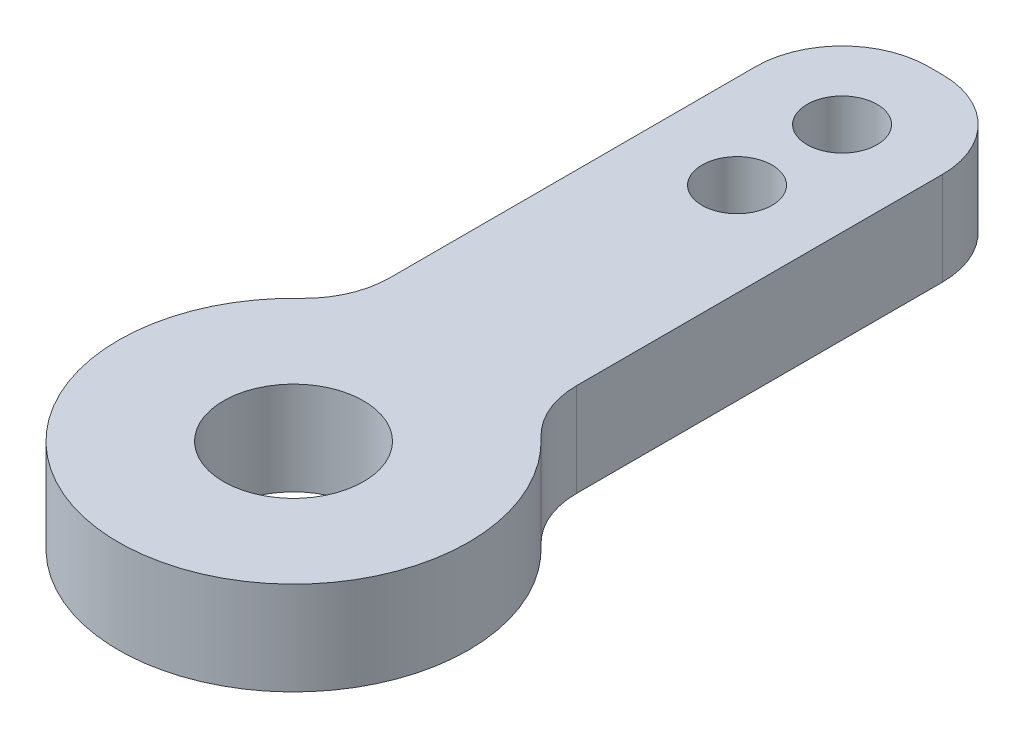
ISO-10303-21;
HEADER;
FILE_DESCRIPTION(('STEP AP214'),'2;1');
FILE_NAME('part.step','',(''),(''),'','','');
FILE_SCHEMA(('AUTOMOTIVE_DESIGN { 1 0 10303 214 1 1 1 1 }'));
ENDSEC;
DATA;
#1=APPLICATION_CONTEXT('core data for automotive mechanical design processes');
#2=APPLICATION_PROTOCOL_DEFINITION('international standard','automotive_design',2000,#1);
#3=PRODUCT_CONTEXT('',#1,'mechanical');
#4=PRODUCT('Part','Part','',(#3));
#5=PRODUCT_RELATED_PRODUCT_CATEGORY('part','',(#4));
#6=PRODUCT_DEFINITION_FORMATION('','',#4);
#7=PRODUCT_DEFINITION_CONTEXT('part definition',#1,'design');
#8=PRODUCT_DEFINITION('design','',#6,#7);
#9=PRODUCT_DEFINITION_SHAPE('','',#8);
#10=(LENGTH_UNIT() NAMED_UNIT(*) SI_UNIT(.MILLI.,.METRE.));
#11=(NAMED_UNIT(*) PLANE_ANGLE_UNIT() SI_UNIT($,.RADIAN.));
#12=(NAMED_UNIT(*) SI_UNIT($,.STERADIAN.) SOLID_ANGLE_UNIT());
#13=UNCERTAINTY_MEASURE_WITH_UNIT(LENGTH_MEASURE(1.E-05),#10,'distance_accuracy_value','');
#14=(GEOMETRIC_REPRESENTATION_CONTEXT(3) GLOBAL_UNCERTAINTY_ASSIGNED_CONTEXT((#13)) GLOBAL_UNIT_ASSIGNED_CONTEXT((#10,
#11,#12)) REPRESENTATION_CONTEXT('',''));
#15=CARTESIAN_POINT('',(0.,0.,0.));
#16=DIRECTION('',(0.,0.,1.));
#17=DIRECTION('',(1.,0.,0.));
#18=AXIS2_PLACEMENT_3D('',#15,#16,#17);
#19=CARTESIAN_POINT('',(7.69999999999999,4.,6.86673497296442));
#20=DIRECTION('',(0.,1.,0.));
#21=DIRECTION('',(0.,0.,1.));
#22=AXIS2_PLACEMENT_3D('',#19,#20,#21);
#23=PLANE('',#22);
#24=CARTESIAN_POINT('',(0.,4.,-8.50000000000001));
#25=DIRECTION('',(0.,1.,0.));
#26=DIRECTION('',(0.,0.,1.));
#27=AXIS2_PLACEMENT_3D('',#24,#25,#26);
#28=CIRCLE('',#27,1.5);
#29=CARTESIAN_POINT('',(0.,4.,-7.));
#30=VERTEX_POINT('',#29);
#31=EDGE_CURVE('E188',#30,#30,#28,.T.);
#32=ORIENTED_EDGE('',*,*,#31,.F.);
#33=EDGE_LOOP('',(#32));
#34=FACE_BOUND('',#33,.T.);
#35=CARTESIAN_POINT('',(7.69999999999999,4.,6.86673497296442));
#36=DIRECTION('',(0.,-1.,0.));
#37=DIRECTION('',(0.,0.,1.));
#38=AXIS2_PLACEMENT_3D('',#35,#36,#37);
#39=CIRCLE('',#38,3.7);
#40=CARTESIAN_POINT('',(5.15625,4.,9.55361716939582));
#41=VERTEX_POINT('',#40);
#42=CARTESIAN_POINT('',(3.99999999999999,4.,6.86673497296442));
#43=VERTEX_POINT('',#42);
#44=EDGE_CURVE('E153',#41,#43,#39,.T.);
#45=ORIENTED_EDGE('',*,*,#44,.T.);
#46=DIRECTION('',(0.,0.,-1.));
#47=VECTOR('',#46,1.);
#48=CARTESIAN_POINT('',(4.,4.,-8.8));
#49=LINE('',#48,#47);
#50=CARTESIAN_POINT('',(4.,4.,-8.8));
#51=VERTEX_POINT('',#50);
#52=EDGE_CURVE('E101',#43,#51,#49,.T.);
#53=ORIENTED_EDGE('',*,*,#52,.T.);
#54=CARTESIAN_POINT('',(0.299999999999997,4.,-8.8));
#55=DIRECTION('',(0.,1.,0.));
#56=DIRECTION('',(0.,0.,1.));
#57=AXIS2_PLACEMENT_3D('',#54,#55,#56);
#58=CIRCLE('',#57,3.7);
#59=CARTESIAN_POINT('',(0.299999999999997,4.,-12.5));
#60=VERTEX_POINT('',#59);
#61=EDGE_CURVE('E169',#51,#60,#58,.T.);
#62=ORIENTED_EDGE('',*,*,#61,.T.);
#63=DIRECTION('',(-1.,0.,0.));
#64=VECTOR('',#63,1.);
#65=CARTESIAN_POINT('',(-0.300000000000003,4.,-12.5));
#66=LINE('',#65,#64);
#67=CARTESIAN_POINT('',(-0.300000000000003,4.,-12.5));
#68=VERTEX_POINT('',#67);
#69=EDGE_CURVE('E182',#60,#68,#66,.T.);
#70=ORIENTED_EDGE('',*,*,#69,.T.);
#71=CARTESIAN_POINT('',(-0.300000000000003,4.,-8.8));
#72=DIRECTION('',(0.,1.,0.));
#73=DIRECTION('',(0.,0.,-1.));
#74=AXIS2_PLACEMENT_3D('',#71,#72,#73);
#75=CIRCLE('',#74,3.7);
#76=CARTESIAN_POINT('',(-4.,4.,-8.8));
#77=VERTEX_POINT('',#76);
#78=EDGE_CURVE('E118',#68,#77,#75,.T.);
#79=ORIENTED_EDGE('',*,*,#78,.T.);
#80=DIRECTION('',(0.,0.,1.));
#81=VECTOR('',#80,1.);
#82=CARTESIAN_POINT('',(-4.,4.,-8.80000000000001));
#83=LINE('',#82,#81);
#84=CARTESIAN_POINT('',(-4.00000000000001,4.,6.86673497296443));
#85=VERTEX_POINT('',#84);
#86=EDGE_CURVE('E111',#77,#85,#83,.T.);
#87=ORIENTED_EDGE('',*,*,#86,.T.);
#88=CARTESIAN_POINT('',(-7.70000000000001,4.,6.86673497296443));
#89=DIRECTION('',(0.,-1.,0.));
#90=DIRECTION('',(0.,0.,-1.));
#91=AXIS2_PLACEMENT_3D('',#88,#89,#90);
#92=CIRCLE('',#91,3.7);
#93=CARTESIAN_POINT('',(-5.15625,4.,9.55361716939582));
#94=VERTEX_POINT('',#93);
#95=EDGE_CURVE('E119',#85,#94,#92,.T.);
#96=ORIENTED_EDGE('',*,*,#95,.T.);
#97=CARTESIAN_POINT('',(0.,4.,15.));
#98=DIRECTION('',(0.,1.,0.));
#99=DIRECTION('',(0.,0.,1.));
#100=AXIS2_PLACEMENT_3D('',#97,#98,#99);
#101=CIRCLE('',#100,7.5);
#102=EDGE_CURVE('E59',#94,#41,#101,.T.);
#103=ORIENTED_EDGE('',*,*,#102,.T.);
#104=EDGE_LOOP('',(#45,#53,#62,#70,#79,#87,#96,#103));
#105=FACE_BOUND('',#104,.T.);
#106=CARTESIAN_POINT('',(0.,4.,15.));
#107=DIRECTION('',(0.,1.,0.));
#108=DIRECTION('',(0.,0.,1.));
#109=AXIS2_PLACEMENT_3D('',#106,#107,#108);
#110=CIRCLE('',#109,3.);
#111=CARTESIAN_POINT('',(0.,4.,18.));
#112=VERTEX_POINT('',#111);
#113=EDGE_CURVE('E142',#112,#112,#110,.T.);
#114=ORIENTED_EDGE('',*,*,#113,.F.);
#115=EDGE_LOOP('',(#114));
#116=FACE_BOUND('',#115,.T.);
#117=CARTESIAN_POINT('',(0.,4.,-4.00000000000001));
#118=DIRECTION('',(0.,1.,0.));
#119=DIRECTION('',(0.,0.,1.));
#120=AXIS2_PLACEMENT_3D('',#117,#118,#119);
#121=CIRCLE('',#120,1.5);
#122=CARTESIAN_POINT('',(0.,4.,-2.5));
#123=VERTEX_POINT('',#122);
#124=EDGE_CURVE('E198',#123,#123,#121,.T.);
#125=ORIENTED_EDGE('',*,*,#124,.F.);
#126=EDGE_LOOP('',(#125));
#127=FACE_BOUND('',#126,.T.);
#128=ADVANCED_FACE('F41',(#34,#105,#116,#127),#23,.T.);
#129=CARTESIAN_POINT('',(7.69999999999999,0.,6.86673497296442));
#130=DIRECTION('',(0.,1.,0.));
#131=DIRECTION('',(0.,0.,1.));
#132=AXIS2_PLACEMENT_3D('',#129,#130,#131);
#133=PLANE('',#132);
#134=CARTESIAN_POINT('',(7.69999999999999,0.,6.86673497296442));
#135=DIRECTION('',(0.,-1.,0.));
#136=DIRECTION('',(0.,0.,1.));
#137=AXIS2_PLACEMENT_3D('',#134,#135,#136);
#138=CIRCLE('',#137,3.7);
#139=CARTESIAN_POINT('',(5.15625,0.,9.55361716939582));
#140=VERTEX_POINT('',#139);
#141=CARTESIAN_POINT('',(3.99999999999999,0.,6.86673497296442));
#142=VERTEX_POINT('',#141);
#143=EDGE_CURVE('E136',#140,#142,#138,.T.);
#144=ORIENTED_EDGE('',*,*,#143,.F.);
#145=CARTESIAN_POINT('',(0.,0.,15.));
#146=DIRECTION('',(0.,1.,0.));
#147=DIRECTION('',(0.,0.,1.));
#148=AXIS2_PLACEMENT_3D('',#145,#146,#147);
#149=CIRCLE('',#148,7.5);
#150=CARTESIAN_POINT('',(-5.15625,0.,9.55361716939582));
#151=VERTEX_POINT('',#150);
#152=EDGE_CURVE('E91',#151,#140,#149,.T.);
#153=ORIENTED_EDGE('',*,*,#152,.F.);
#154=CARTESIAN_POINT('',(-7.70000000000001,0.,6.86673497296443));
#155=DIRECTION('',(0.,-1.,0.));
#156=DIRECTION('',(0.,0.,-1.));
#157=AXIS2_PLACEMENT_3D('',#154,#155,#156);
#158=CIRCLE('',#157,3.7);
#159=CARTESIAN_POINT('',(-4.00000000000001,0.,6.86673497296443));
#160=VERTEX_POINT('',#159);
#161=EDGE_CURVE('E87',#160,#151,#158,.T.);
#162=ORIENTED_EDGE('',*,*,#161,.F.);
#163=DIRECTION('',(0.,0.,1.));
#164=VECTOR('',#163,1.);
#165=CARTESIAN_POINT('',(-4.,0.,-8.80000000000001));
#166=LINE('',#165,#164);
#167=CARTESIAN_POINT('',(-4.,0.,-8.8));
#168=VERTEX_POINT('',#167);
#169=EDGE_CURVE('E126',#168,#160,#166,.T.);
#170=ORIENTED_EDGE('',*,*,#169,.F.);
#171=CARTESIAN_POINT('',(-0.300000000000003,0.,-8.8));
#172=DIRECTION('',(0.,1.,0.));
#173=DIRECTION('',(0.,0.,-1.));
#174=AXIS2_PLACEMENT_3D('',#171,#172,#173);
#175=CIRCLE('',#174,3.7);
#176=CARTESIAN_POINT('',(-0.300000000000003,0.,-12.5));
#177=VERTEX_POINT('',#176);
#178=EDGE_CURVE('E146',#177,#168,#175,.T.);
#179=ORIENTED_EDGE('',*,*,#178,.F.);
#180=DIRECTION('',(-1.,0.,0.));
#181=VECTOR('',#180,1.);
#182=CARTESIAN_POINT('',(-0.300000000000003,0.,-12.5));
#183=LINE('',#182,#181);
#184=CARTESIAN_POINT('',(0.299999999999997,0.,-12.5));
#185=VERTEX_POINT('',#184);
#186=EDGE_CURVE('E148',#185,#177,#183,.T.);
#187=ORIENTED_EDGE('',*,*,#186,.F.);
#188=CARTESIAN_POINT('',(0.299999999999997,0.,-8.8));
#189=DIRECTION('',(0.,1.,0.));
#190=DIRECTION('',(0.,0.,1.));
#191=AXIS2_PLACEMENT_3D('',#188,#189,#190);
#192=CIRCLE('',#191,3.7);
#193=CARTESIAN_POINT('',(4.,0.,-8.8));
#194=VERTEX_POINT('',#193);
#195=EDGE_CURVE('E145',#194,#185,#192,.T.);
#196=ORIENTED_EDGE('',*,*,#195,.F.);
#197=DIRECTION('',(0.,0.,-1.));
#198=VECTOR('',#197,1.);
#199=CARTESIAN_POINT('',(4.,0.,-8.8));
#200=LINE('',#199,#198);
#201=EDGE_CURVE('E143',#142,#194,#200,.T.);
#202=ORIENTED_EDGE('',*,*,#201,.F.);
#203=EDGE_LOOP('',(#144,#153,#162,#170,#179,#187,#196,#202));
#204=FACE_BOUND('',#203,.T.);
#205=CARTESIAN_POINT('',(0.,0.,15.));
#206=DIRECTION('',(0.,1.,0.));
#207=DIRECTION('',(0.,0.,1.));
#208=AXIS2_PLACEMENT_3D('',#205,#206,#207);
#209=CIRCLE('',#208,3.);
#210=CARTESIAN_POINT('',(0.,0.,18.));
#211=VERTEX_POINT('',#210);
#212=EDGE_CURVE('E190',#211,#211,#209,.T.);
#213=ORIENTED_EDGE('',*,*,#212,.T.);
#214=EDGE_LOOP('',(#213));
#215=FACE_BOUND('',#214,.T.);
#216=CARTESIAN_POINT('',(0.,0.,-8.50000000000001));
#217=DIRECTION('',(0.,1.,0.));
#218=DIRECTION('',(0.,0.,1.));
#219=AXIS2_PLACEMENT_3D('',#216,#217,#218);
#220=CIRCLE('',#219,1.5);
#221=CARTESIAN_POINT('',(0.,0.,-7.));
#222=VERTEX_POINT('',#221);
#223=EDGE_CURVE('E191',#222,#222,#220,.T.);
#224=ORIENTED_EDGE('',*,*,#223,.T.);
#225=EDGE_LOOP('',(#224));
#226=FACE_BOUND('',#225,.T.);
#227=CARTESIAN_POINT('',(0.,0.,-4.00000000000001));
#228=DIRECTION('',(0.,1.,0.));
#229=DIRECTION('',(0.,0.,1.));
#230=AXIS2_PLACEMENT_3D('',#227,#228,#229);
#231=CIRCLE('',#230,1.5);
#232=CARTESIAN_POINT('',(0.,0.,-2.5));
#233=VERTEX_POINT('',#232);
#234=EDGE_CURVE('E200',#233,#233,#231,.T.);
#235=ORIENTED_EDGE('',*,*,#234,.T.);
#236=EDGE_LOOP('',(#235));
#237=FACE_BOUND('',#236,.T.);
#238=ADVANCED_FACE('F175',(#204,#215,#226,#237),#133,.F.);
#239=CARTESIAN_POINT('',(7.69999999999999,4.,6.86673497296442));
#240=DIRECTION('',(0.,-1.,0.));
#241=DIRECTION('',(0.,0.,-1.));
#242=AXIS2_PLACEMENT_3D('',#239,#240,#241);
#243=CYLINDRICAL_SURFACE('',#242,3.7);
#244=ORIENTED_EDGE('',*,*,#143,.T.);
#245=DIRECTION('',(0.,-1.,0.));
#246=VECTOR('',#245,1.);
#247=CARTESIAN_POINT('',(3.99999999999999,4.,6.86673497296442));
#248=LINE('',#247,#246);
#249=EDGE_CURVE('E11',#43,#142,#248,.T.);
#250=ORIENTED_EDGE('',*,*,#249,.F.);
#251=ORIENTED_EDGE('',*,*,#44,.F.);
#252=DIRECTION('',(0.,-1.,0.));
#253=VECTOR('',#252,1.);
#254=CARTESIAN_POINT('',(5.15625,4.,9.55361716939582));
#255=LINE('',#254,#253);
#256=EDGE_CURVE('E131',#41,#140,#255,.T.);
#257=ORIENTED_EDGE('',*,*,#256,.T.);
#258=EDGE_LOOP('',(#244,#250,#251,#257));
#259=FACE_BOUND('',#258,.T.);
#260=ADVANCED_FACE('F43',(#259),#243,.F.);
#261=CARTESIAN_POINT('',(4.,4.,-8.8));
#262=DIRECTION('',(-1.,0.,0.));
#263=DIRECTION('',(0.,0.,1.));
#264=AXIS2_PLACEMENT_3D('',#261,#262,#263);
#265=PLANE('',#264);
#266=ORIENTED_EDGE('',*,*,#201,.T.);
#267=DIRECTION('',(0.,-1.,0.));
#268=VECTOR('',#267,1.);
#269=CARTESIAN_POINT('',(4.,4.,-8.8));
#270=LINE('',#269,#268);
#271=EDGE_CURVE('E49',#51,#194,#270,.T.);
#272=ORIENTED_EDGE('',*,*,#271,.F.);
#273=ORIENTED_EDGE('',*,*,#52,.F.);
#274=ORIENTED_EDGE('',*,*,#249,.T.);
#275=EDGE_LOOP('',(#266,#272,#273,#274));
#276=FACE_BOUND('',#275,.T.);
#277=ADVANCED_FACE('F231',(#276),#265,.F.);
#278=CARTESIAN_POINT('',(0.299999999999997,4.,-8.8));
#279=DIRECTION('',(0.,-1.,0.));
#280=DIRECTION('',(0.,0.,-1.));
#281=AXIS2_PLACEMENT_3D('',#278,#279,#280);
#282=CYLINDRICAL_SURFACE('',#281,3.7);
#283=ORIENTED_EDGE('',*,*,#195,.T.);
#284=DIRECTION('',(0.,-1.,0.));
#285=VECTOR('',#284,1.);
#286=CARTESIAN_POINT('',(0.299999999999997,4.,-12.5));
#287=LINE('',#286,#285);
#288=EDGE_CURVE('E159',#60,#185,#287,.T.);
#289=ORIENTED_EDGE('',*,*,#288,.F.);
#290=ORIENTED_EDGE('',*,*,#61,.F.);
#291=ORIENTED_EDGE('',*,*,#271,.T.);
#292=EDGE_LOOP('',(#283,#289,#290,#291));
#293=FACE_BOUND('',#292,.T.);
#294=ADVANCED_FACE('F167',(#293),#282,.T.);
#295=CARTESIAN_POINT('',(-0.300000000000003,4.,-12.5));
#296=DIRECTION('',(0.,0.,1.));
#297=DIRECTION('',(1.,0.,0.));
#298=AXIS2_PLACEMENT_3D('',#295,#296,#297);
#299=PLANE('',#298);
#300=ORIENTED_EDGE('',*,*,#186,.T.);
#301=DIRECTION('',(0.,-1.,0.));
#302=VECTOR('',#301,1.);
#303=CARTESIAN_POINT('',(-0.300000000000003,4.,-12.5));
#304=LINE('',#303,#302);
#305=EDGE_CURVE('E160',#68,#177,#304,.T.);
#306=ORIENTED_EDGE('',*,*,#305,.F.);
#307=ORIENTED_EDGE('',*,*,#69,.F.);
#308=ORIENTED_EDGE('',*,*,#288,.T.);
#309=EDGE_LOOP('',(#300,#306,#307,#308));
#310=FACE_BOUND('',#309,.T.);
#311=ADVANCED_FACE('F180',(#310),#299,.F.);
#312=CARTESIAN_POINT('',(-0.300000000000003,4.,-8.8));
#313=DIRECTION('',(0.,-1.,0.));
#314=DIRECTION('',(0.,0.,-1.));
#315=AXIS2_PLACEMENT_3D('',#312,#313,#314);
#316=CYLINDRICAL_SURFACE('',#315,3.7);
#317=ORIENTED_EDGE('',*,*,#178,.T.);
#318=DIRECTION('',(0.,-1.,0.));
#319=VECTOR('',#318,1.);
#320=CARTESIAN_POINT('',(-4.,4.,-8.8));
#321=LINE('',#320,#319);
#322=EDGE_CURVE('E129',#77,#168,#321,.T.);
#323=ORIENTED_EDGE('',*,*,#322,.F.);
#324=ORIENTED_EDGE('',*,*,#78,.F.);
#325=ORIENTED_EDGE('',*,*,#305,.T.);
#326=EDGE_LOOP('',(#317,#323,#324,#325));
#327=FACE_BOUND('',#326,.T.);
#328=ADVANCED_FACE('F177',(#327),#316,.T.);
#329=CARTESIAN_POINT('',(-4.,4.,-8.80000000000001));
#330=DIRECTION('',(1.,0.,0.));
#331=DIRECTION('',(0.,0.,-1.));
#332=AXIS2_PLACEMENT_3D('',#329,#330,#331);
#333=PLANE('',#332);
#334=ORIENTED_EDGE('',*,*,#169,.T.);
#335=DIRECTION('',(0.,-1.,0.));
#336=VECTOR('',#335,1.);
#337=CARTESIAN_POINT('',(-4.00000000000001,4.,6.86673497296443));
#338=LINE('',#337,#336);
#339=EDGE_CURVE('E122',#85,#160,#338,.T.);
#340=ORIENTED_EDGE('',*,*,#339,.F.);
#341=ORIENTED_EDGE('',*,*,#86,.F.);
#342=ORIENTED_EDGE('',*,*,#322,.T.);
#343=EDGE_LOOP('',(#334,#340,#341,#342));
#344=FACE_BOUND('',#343,.T.);
#345=ADVANCED_FACE('F127',(#344),#333,.F.);
#346=CARTESIAN_POINT('',(-7.70000000000001,4.,6.86673497296443));
#347=DIRECTION('',(0.,-1.,0.));
#348=DIRECTION('',(0.,0.,-1.));
#349=AXIS2_PLACEMENT_3D('',#346,#347,#348);
#350=CYLINDRICAL_SURFACE('',#349,3.7);
#351=ORIENTED_EDGE('',*,*,#161,.T.);
#352=DIRECTION('',(0.,-1.,0.));
#353=VECTOR('',#352,1.);
#354=CARTESIAN_POINT('',(-5.15625,4.,9.55361716939582));
#355=LINE('',#354,#353);
#356=EDGE_CURVE('E128',#94,#151,#355,.T.);
#357=ORIENTED_EDGE('',*,*,#356,.F.);
#358=ORIENTED_EDGE('',*,*,#95,.F.);
#359=ORIENTED_EDGE('',*,*,#339,.T.);
#360=EDGE_LOOP('',(#351,#357,#358,#359));
#361=FACE_BOUND('',#360,.T.);
#362=ADVANCED_FACE('F135',(#361),#350,.F.);
#363=CARTESIAN_POINT('',(0.,4.,15.));
#364=DIRECTION('',(0.,-1.,0.));
#365=DIRECTION('',(0.,0.,-1.));
#366=AXIS2_PLACEMENT_3D('',#363,#364,#365);
#367=CYLINDRICAL_SURFACE('',#366,7.5);
#368=ORIENTED_EDGE('',*,*,#152,.T.);
#369=ORIENTED_EDGE('',*,*,#256,.F.);
#370=ORIENTED_EDGE('',*,*,#102,.F.);
#371=ORIENTED_EDGE('',*,*,#356,.T.);
#372=EDGE_LOOP('',(#368,#369,#370,#371));
#373=FACE_BOUND('',#372,.T.);
#374=ADVANCED_FACE('F222',(#373),#367,.T.);
#375=CARTESIAN_POINT('',(0.,4.,15.));
#376=DIRECTION('',(0.,-1.,0.));
#377=DIRECTION('',(0.,0.,-1.));
#378=AXIS2_PLACEMENT_3D('',#375,#376,#377);
#379=CYLINDRICAL_SURFACE('',#378,3.);
#380=ORIENTED_EDGE('',*,*,#113,.T.);
#381=EDGE_LOOP('',(#380));
#382=FACE_BOUND('',#381,.T.);
#383=ORIENTED_EDGE('',*,*,#212,.F.);
#384=EDGE_LOOP('',(#383));
#385=FACE_BOUND('',#384,.T.);
#386=ADVANCED_FACE('F217',(#382,#385),#379,.F.);
#387=CARTESIAN_POINT('',(0.,4.,-8.50000000000001));
#388=DIRECTION('',(0.,-1.,0.));
#389=DIRECTION('',(0.,0.,-1.));
#390=AXIS2_PLACEMENT_3D('',#387,#388,#389);
#391=CYLINDRICAL_SURFACE('',#390,1.5);
#392=ORIENTED_EDGE('',*,*,#31,.T.);
#393=EDGE_LOOP('',(#392));
#394=FACE_BOUND('',#393,.T.);
#395=ORIENTED_EDGE('',*,*,#223,.F.);
#396=EDGE_LOOP('',(#395));
#397=FACE_BOUND('',#396,.T.);
#398=ADVANCED_FACE('F297',(#394,#397),#391,.F.);
#399=CARTESIAN_POINT('',(0.,4.,-4.00000000000001));
#400=DIRECTION('',(0.,-1.,0.));
#401=DIRECTION('',(0.,0.,-1.));
#402=AXIS2_PLACEMENT_3D('',#399,#400,#401);
#403=CYLINDRICAL_SURFACE('',#402,1.5);
#404=ORIENTED_EDGE('',*,*,#124,.T.);
#405=EDGE_LOOP('',(#404));
#406=FACE_BOUND('',#405,.T.);
#407=ORIENTED_EDGE('',*,*,#234,.F.);
#408=EDGE_LOOP('',(#407));
#409=FACE_BOUND('',#408,.T.);
#410=ADVANCED_FACE('F202',(#406,#409),#403,.F.);
#411=CLOSED_SHELL('',(#128,#238,#260,#277,#294,#311,#328,#345,#362,#374,#386,#398,#410));
#412=MANIFOLD_SOLID_BREP('B2',#411);
#413=ADVANCED_BREP_SHAPE_REPRESENTATION('',(#18,#412),#14);
#414=SHAPE_DEFINITION_REPRESENTATION(#9,#413);
ENDSEC;
END-ISO-10303-21;
